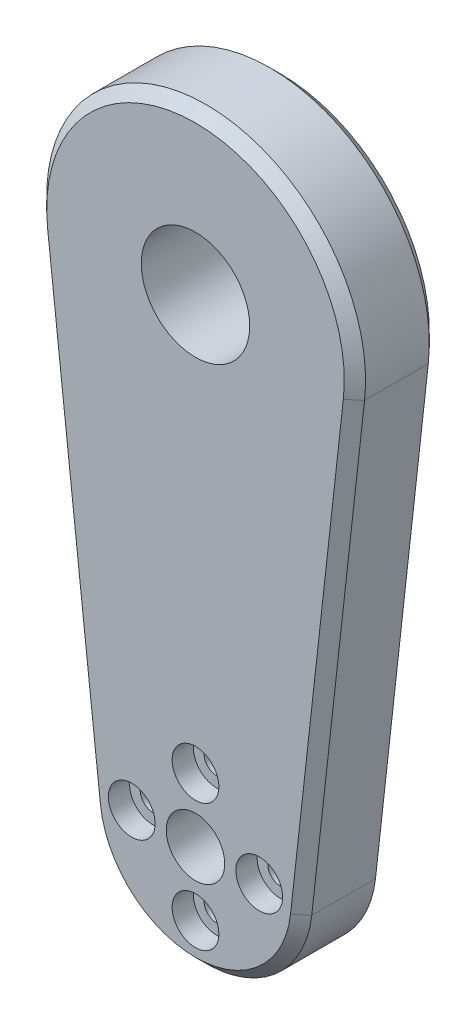
ISO-10303-21;
HEADER;
FILE_DESCRIPTION(('STEP AP214'),'2;1');
FILE_NAME('part.step','',(''),(''),'','','');
FILE_SCHEMA(('AUTOMOTIVE_DESIGN { 1 0 10303 214 1 1 1 1 }'));
ENDSEC;
DATA;
#1=APPLICATION_CONTEXT('core data for automotive mechanical design processes');
#2=APPLICATION_PROTOCOL_DEFINITION('international standard','automotive_design',2000,#1);
#3=PRODUCT_CONTEXT('',#1,'mechanical');
#4=PRODUCT('Part','Part','',(#3));
#5=PRODUCT_RELATED_PRODUCT_CATEGORY('part','',(#4));
#6=PRODUCT_DEFINITION_FORMATION('','',#4);
#7=PRODUCT_DEFINITION_CONTEXT('part definition',#1,'design');
#8=PRODUCT_DEFINITION('design','',#6,#7);
#9=PRODUCT_DEFINITION_SHAPE('','',#8);
#10=(LENGTH_UNIT() NAMED_UNIT(*) SI_UNIT(.MILLI.,.METRE.));
#11=(NAMED_UNIT(*) PLANE_ANGLE_UNIT() SI_UNIT($,.RADIAN.));
#12=(NAMED_UNIT(*) SI_UNIT($,.STERADIAN.) SOLID_ANGLE_UNIT());
#13=UNCERTAINTY_MEASURE_WITH_UNIT(LENGTH_MEASURE(1.E-05),#10,'distance_accuracy_value','');
#14=(GEOMETRIC_REPRESENTATION_CONTEXT(3) GLOBAL_UNCERTAINTY_ASSIGNED_CONTEXT((#13)) GLOBAL_UNIT_ASSIGNED_CONTEXT((#10,
#11,#12)) REPRESENTATION_CONTEXT('',''));
#15=CARTESIAN_POINT('',(0.,0.,0.));
#16=DIRECTION('',(0.,0.,1.));
#17=DIRECTION('',(1.,0.,0.));
#18=AXIS2_PLACEMENT_3D('',#15,#16,#17);
#19=CARTESIAN_POINT('',(9.93807989999907,-1.11111111111111,8.));
#20=DIRECTION('',(-0.993807989999907,0.111111111111111,0.));
#21=DIRECTION('',(-0.111111111111111,-0.993807989999906,0.));
#22=AXIS2_PLACEMENT_3D('',#19,#20,#21);
#23=PLANE('',#22);
#24=DIRECTION('',(0.,0.,-1.));
#25=VECTOR('',#24,1.);
#26=CARTESIAN_POINT('',(14.9071198499986,43.3333333333333,8.));
#27=LINE('',#26,#25);
#28=CARTESIAN_POINT('',(14.9071198499986,43.3333333333333,7.00000000000001));
#29=VERTEX_POINT('',#28);
#30=CARTESIAN_POINT('',(14.9071198499986,43.3333333333333,1.));
#31=VERTEX_POINT('',#30);
#32=EDGE_CURVE('E160',#29,#31,#27,.T.);
#33=ORIENTED_EDGE('',*,*,#32,.F.);
#34=DIRECTION('',(-0.111111111111111,-0.993807989999906,0.));
#35=VECTOR('',#34,1.);
#36=CARTESIAN_POINT('',(9.93807989999907,-1.11111111111111,7.00000000000001));
#37=LINE('',#36,#35);
#38=CARTESIAN_POINT('',(9.93807989999907,-1.11111111111111,7.00000000000001));
#39=VERTEX_POINT('',#38);
#40=EDGE_CURVE('E181',#29,#39,#37,.T.);
#41=ORIENTED_EDGE('',*,*,#40,.T.);
#42=DIRECTION('',(0.,0.,-1.));
#43=VECTOR('',#42,1.);
#44=CARTESIAN_POINT('',(9.93807989999907,-1.11111111111111,8.));
#45=LINE('',#44,#43);
#46=CARTESIAN_POINT('',(9.93807989999907,-1.11111111111111,1.));
#47=VERTEX_POINT('',#46);
#48=EDGE_CURVE('E118',#39,#47,#45,.T.);
#49=ORIENTED_EDGE('',*,*,#48,.T.);
#50=DIRECTION('',(0.111111111111111,0.993807989999906,0.));
#51=VECTOR('',#50,1.);
#52=CARTESIAN_POINT('',(9.93807989999907,-1.11111111111111,1.));
#53=LINE('',#52,#51);
#54=EDGE_CURVE('E178',#47,#31,#53,.T.);
#55=ORIENTED_EDGE('',*,*,#54,.T.);
#56=EDGE_LOOP('',(#33,#41,#49,#55));
#57=FACE_BOUND('',#56,.T.);
#58=ADVANCED_FACE('F42',(#57),#23,.F.);
#59=CARTESIAN_POINT('',(0.,45.,8.));
#60=DIRECTION('',(0.,0.,-1.));
#61=DIRECTION('',(-1.,0.,0.));
#62=AXIS2_PLACEMENT_3D('',#59,#60,#61);
#63=CYLINDRICAL_SURFACE('',#62,15.);
#64=DIRECTION('',(0.,0.,-1.));
#65=VECTOR('',#64,1.);
#66=CARTESIAN_POINT('',(-14.9071198499986,43.3333333333333,8.));
#67=LINE('',#66,#65);
#68=CARTESIAN_POINT('',(-14.9071198499986,43.3333333333333,7.00000000000001));
#69=VERTEX_POINT('',#68);
#70=CARTESIAN_POINT('',(-14.9071198499986,43.3333333333333,1.));
#71=VERTEX_POINT('',#70);
#72=EDGE_CURVE('E137',#69,#71,#67,.T.);
#73=ORIENTED_EDGE('',*,*,#72,.F.);
#74=CARTESIAN_POINT('',(0.,45.,7.00000000000001));
#75=DIRECTION('',(0.,0.,1.));
#76=DIRECTION('',(1.,0.,0.));
#77=AXIS2_PLACEMENT_3D('',#74,#75,#76);
#78=CIRCLE('',#77,15.);
#79=EDGE_CURVE('E175',#69,#29,#78,.F.);
#80=ORIENTED_EDGE('',*,*,#79,.T.);
#81=ORIENTED_EDGE('',*,*,#32,.T.);
#82=CARTESIAN_POINT('',(0.,45.,1.));
#83=DIRECTION('',(0.,0.,1.));
#84=DIRECTION('',(1.,0.,0.));
#85=AXIS2_PLACEMENT_3D('',#82,#83,#84);
#86=CIRCLE('',#85,15.);
#87=EDGE_CURVE('E124',#31,#71,#86,.T.);
#88=ORIENTED_EDGE('',*,*,#87,.T.);
#89=EDGE_LOOP('',(#73,#80,#81,#88));
#90=FACE_BOUND('',#89,.T.);
#91=ADVANCED_FACE('F225',(#90),#63,.T.);
#92=CARTESIAN_POINT('',(-9.93807989999907,-1.11111111111111,8.));
#93=DIRECTION('',(-0.993807989999907,-0.111111111111111,0.));
#94=DIRECTION('',(0.111111111111111,-0.993807989999906,0.));
#95=AXIS2_PLACEMENT_3D('',#92,#93,#94);
#96=PLANE('',#95);
#97=DIRECTION('',(0.,0.,-1.));
#98=VECTOR('',#97,1.);
#99=CARTESIAN_POINT('',(-9.93807989999907,-1.11111111111111,8.));
#100=LINE('',#99,#98);
#101=CARTESIAN_POINT('',(-9.93807989999907,-1.11111111111111,7.00000000000001));
#102=VERTEX_POINT('',#101);
#103=CARTESIAN_POINT('',(-9.93807989999907,-1.11111111111111,1.));
#104=VERTEX_POINT('',#103);
#105=EDGE_CURVE('E116',#102,#104,#100,.T.);
#106=ORIENTED_EDGE('',*,*,#105,.F.);
#107=DIRECTION('',(-0.111111111111111,0.993807989999906,0.));
#108=VECTOR('',#107,1.);
#109=CARTESIAN_POINT('',(-9.93807989999907,-1.11111111111111,7.00000000000001));
#110=LINE('',#109,#108);
#111=EDGE_CURVE('E133',#102,#69,#110,.T.);
#112=ORIENTED_EDGE('',*,*,#111,.T.);
#113=ORIENTED_EDGE('',*,*,#72,.T.);
#114=DIRECTION('',(0.111111111111111,-0.993807989999906,0.));
#115=VECTOR('',#114,1.);
#116=CARTESIAN_POINT('',(-9.93807989999907,-1.11111111111111,1.));
#117=LINE('',#116,#115);
#118=EDGE_CURVE('E135',#71,#104,#117,.T.);
#119=ORIENTED_EDGE('',*,*,#118,.T.);
#120=EDGE_LOOP('',(#106,#112,#113,#119));
#121=FACE_BOUND('',#120,.T.);
#122=ADVANCED_FACE('F130',(#121),#96,.T.);
#123=CARTESIAN_POINT('',(0.,0.,8.));
#124=DIRECTION('',(0.,0.,-1.));
#125=DIRECTION('',(-1.,0.,0.));
#126=AXIS2_PLACEMENT_3D('',#123,#124,#125);
#127=CYLINDRICAL_SURFACE('',#126,2.75);
#128=CARTESIAN_POINT('',(0.,0.,8.));
#129=DIRECTION('',(0.,0.,1.));
#130=DIRECTION('',(1.,0.,0.));
#131=AXIS2_PLACEMENT_3D('',#128,#129,#130);
#132=CIRCLE('',#131,2.75);
#133=CARTESIAN_POINT('',(2.75,0.,8.));
#134=VERTEX_POINT('',#133);
#135=EDGE_CURVE('E232',#134,#134,#132,.T.);
#136=ORIENTED_EDGE('',*,*,#135,.T.);
#137=EDGE_LOOP('',(#136));
#138=FACE_BOUND('',#137,.T.);
#139=CARTESIAN_POINT('',(0.,0.,0.));
#140=DIRECTION('',(0.,0.,1.));
#141=DIRECTION('',(1.,0.,0.));
#142=AXIS2_PLACEMENT_3D('',#139,#140,#141);
#143=CIRCLE('',#142,2.75);
#144=CARTESIAN_POINT('',(2.75,0.,0.));
#145=VERTEX_POINT('',#144);
#146=EDGE_CURVE('E233',#145,#145,#143,.T.);
#147=ORIENTED_EDGE('',*,*,#146,.F.);
#148=EDGE_LOOP('',(#147));
#149=FACE_BOUND('',#148,.T.);
#150=ADVANCED_FACE('F330',(#138,#149),#127,.F.);
#151=CARTESIAN_POINT('',(0.,45.,8.));
#152=DIRECTION('',(0.,0.,-1.));
#153=DIRECTION('',(-1.,0.,0.));
#154=AXIS2_PLACEMENT_3D('',#151,#152,#153);
#155=CYLINDRICAL_SURFACE('',#154,5.1);
#156=CARTESIAN_POINT('',(0.,45.,8.));
#157=DIRECTION('',(0.,0.,1.));
#158=DIRECTION('',(1.,0.,0.));
#159=AXIS2_PLACEMENT_3D('',#156,#157,#158);
#160=CIRCLE('',#159,5.1);
#161=CARTESIAN_POINT('',(5.1,45.,8.));
#162=VERTEX_POINT('',#161);
#163=EDGE_CURVE('E237',#162,#162,#160,.T.);
#164=ORIENTED_EDGE('',*,*,#163,.T.);
#165=EDGE_LOOP('',(#164));
#166=FACE_BOUND('',#165,.T.);
#167=CARTESIAN_POINT('',(0.,45.,0.));
#168=DIRECTION('',(0.,0.,1.));
#169=DIRECTION('',(1.,0.,0.));
#170=AXIS2_PLACEMENT_3D('',#167,#168,#169);
#171=CIRCLE('',#170,5.1);
#172=CARTESIAN_POINT('',(5.1,45.,0.));
#173=VERTEX_POINT('',#172);
#174=EDGE_CURVE('E238',#173,#173,#171,.T.);
#175=ORIENTED_EDGE('',*,*,#174,.F.);
#176=EDGE_LOOP('',(#175));
#177=FACE_BOUND('',#176,.T.);
#178=ADVANCED_FACE('F333',(#166,#177),#155,.F.);
#179=CARTESIAN_POINT('',(0.,0.,8.));
#180=DIRECTION('',(0.,0.,-1.));
#181=DIRECTION('',(-1.,0.,0.));
#182=AXIS2_PLACEMENT_3D('',#179,#180,#181);
#183=CYLINDRICAL_SURFACE('',#182,10.);
#184=ORIENTED_EDGE('',*,*,#48,.F.);
#185=CARTESIAN_POINT('',(0.,0.,7.00000000000001));
#186=DIRECTION('',(0.,0.,1.));
#187=DIRECTION('',(1.,0.,0.));
#188=AXIS2_PLACEMENT_3D('',#185,#186,#187);
#189=CIRCLE('',#188,10.);
#190=EDGE_CURVE('E113',#39,#102,#189,.F.);
#191=ORIENTED_EDGE('',*,*,#190,.T.);
#192=ORIENTED_EDGE('',*,*,#105,.T.);
#193=CARTESIAN_POINT('',(0.,0.,1.));
#194=DIRECTION('',(0.,0.,1.));
#195=DIRECTION('',(1.,0.,0.));
#196=AXIS2_PLACEMENT_3D('',#193,#194,#195);
#197=CIRCLE('',#196,10.);
#198=EDGE_CURVE('E125',#104,#47,#197,.T.);
#199=ORIENTED_EDGE('',*,*,#198,.T.);
#200=EDGE_LOOP('',(#184,#191,#192,#199));
#201=FACE_BOUND('',#200,.T.);
#202=ADVANCED_FACE('F115',(#201),#183,.T.);
#203=CARTESIAN_POINT('',(0.,0.,8.));
#204=DIRECTION('',(0.,0.,1.));
#205=DIRECTION('',(1.,0.,0.));
#206=AXIS2_PLACEMENT_3D('',#203,#204,#205);
#207=PLANE('',#206);
#208=CARTESIAN_POINT('',(0.,45.,8.));
#209=DIRECTION('',(0.,0.,1.));
#210=DIRECTION('',(1.,0.,0.));
#211=AXIS2_PLACEMENT_3D('',#208,#209,#210);
#212=CIRCLE('',#211,14.);
#213=CARTESIAN_POINT('',(13.9133118599987,43.4444444444444,8.));
#214=VERTEX_POINT('',#213);
#215=CARTESIAN_POINT('',(-13.9133118599987,43.4444444444444,8.));
#216=VERTEX_POINT('',#215);
#217=EDGE_CURVE('E158',#214,#216,#212,.T.);
#218=ORIENTED_EDGE('',*,*,#217,.T.);
#219=DIRECTION('',(0.111111111111111,-0.993807989999906,0.));
#220=VECTOR('',#219,1.);
#221=CARTESIAN_POINT('',(-8.94427190999917,-1.,8.));
#222=LINE('',#221,#220);
#223=CARTESIAN_POINT('',(-8.94427190999917,-1.,8.));
#224=VERTEX_POINT('',#223);
#225=EDGE_CURVE('E168',#216,#224,#222,.T.);
#226=ORIENTED_EDGE('',*,*,#225,.T.);
#227=CARTESIAN_POINT('',(0.,0.,8.));
#228=DIRECTION('',(0.,0.,1.));
#229=DIRECTION('',(1.,0.,0.));
#230=AXIS2_PLACEMENT_3D('',#227,#228,#229);
#231=CIRCLE('',#230,9.00000000000001);
#232=CARTESIAN_POINT('',(8.94427190999917,-1.,8.));
#233=VERTEX_POINT('',#232);
#234=EDGE_CURVE('E142',#224,#233,#231,.T.);
#235=ORIENTED_EDGE('',*,*,#234,.T.);
#236=DIRECTION('',(0.111111111111111,0.993807989999906,0.));
#237=VECTOR('',#236,1.);
#238=CARTESIAN_POINT('',(13.9133118599987,43.4444444444444,8.));
#239=LINE('',#238,#237);
#240=EDGE_CURVE('E154',#233,#214,#239,.T.);
#241=ORIENTED_EDGE('',*,*,#240,.T.);
#242=EDGE_LOOP('',(#218,#226,#235,#241));
#243=FACE_BOUND('',#242,.T.);
#244=CARTESIAN_POINT('',(0.,-6.,8.));
#245=DIRECTION('',(0.,0.,1.));
#246=DIRECTION('',(1.,0.,0.));
#247=AXIS2_PLACEMENT_3D('',#244,#245,#246);
#248=CIRCLE('',#247,2.19999999999999);
#249=CARTESIAN_POINT('',(2.19999999999999,-6.,8.));
#250=VERTEX_POINT('',#249);
#251=EDGE_CURVE('E200',#250,#250,#248,.T.);
#252=ORIENTED_EDGE('',*,*,#251,.F.);
#253=EDGE_LOOP('',(#252));
#254=FACE_BOUND('',#253,.T.);
#255=CARTESIAN_POINT('',(-6.,0.,8.));
#256=DIRECTION('',(0.,0.,1.));
#257=DIRECTION('',(1.,0.,0.));
#258=AXIS2_PLACEMENT_3D('',#255,#256,#257);
#259=CIRCLE('',#258,2.19999999999999);
#260=CARTESIAN_POINT('',(-3.80000000000001,0.,8.));
#261=VERTEX_POINT('',#260);
#262=EDGE_CURVE('E292',#261,#261,#259,.T.);
#263=ORIENTED_EDGE('',*,*,#262,.F.);
#264=EDGE_LOOP('',(#263));
#265=FACE_BOUND('',#264,.T.);
#266=CARTESIAN_POINT('',(0.,6.,8.));
#267=DIRECTION('',(0.,0.,1.));
#268=DIRECTION('',(1.,0.,0.));
#269=AXIS2_PLACEMENT_3D('',#266,#267,#268);
#270=CIRCLE('',#269,2.19999999999999);
#271=CARTESIAN_POINT('',(2.19999999999999,6.,8.));
#272=VERTEX_POINT('',#271);
#273=EDGE_CURVE('E276',#272,#272,#270,.T.);
#274=ORIENTED_EDGE('',*,*,#273,.F.);
#275=EDGE_LOOP('',(#274));
#276=FACE_BOUND('',#275,.T.);
#277=CARTESIAN_POINT('',(6.,0.,8.));
#278=DIRECTION('',(0.,0.,1.));
#279=DIRECTION('',(1.,0.,0.));
#280=AXIS2_PLACEMENT_3D('',#277,#278,#279);
#281=CIRCLE('',#280,2.19999999999999);
#282=CARTESIAN_POINT('',(8.19999999999999,0.,8.));
#283=VERTEX_POINT('',#282);
#284=EDGE_CURVE('E260',#283,#283,#281,.T.);
#285=ORIENTED_EDGE('',*,*,#284,.F.);
#286=EDGE_LOOP('',(#285));
#287=FACE_BOUND('',#286,.T.);
#288=ORIENTED_EDGE('',*,*,#163,.F.);
#289=EDGE_LOOP('',(#288));
#290=FACE_BOUND('',#289,.T.);
#291=ORIENTED_EDGE('',*,*,#135,.F.);
#292=EDGE_LOOP('',(#291));
#293=FACE_BOUND('',#292,.T.);
#294=ADVANCED_FACE('F314',(#243,#254,#265,#276,#287,#290,#293),#207,.T.);
#295=CARTESIAN_POINT('',(0.,0.,0.));
#296=DIRECTION('',(0.,0.,1.));
#297=DIRECTION('',(1.,0.,0.));
#298=AXIS2_PLACEMENT_3D('',#295,#296,#297);
#299=PLANE('',#298);
#300=CARTESIAN_POINT('',(0.,0.,0.));
#301=DIRECTION('',(0.,0.,1.));
#302=DIRECTION('',(1.,0.,0.));
#303=AXIS2_PLACEMENT_3D('',#300,#301,#302);
#304=CIRCLE('',#303,8.99999999999999);
#305=CARTESIAN_POINT('',(8.94427190999915,-0.999999999999999,0.));
#306=VERTEX_POINT('',#305);
#307=CARTESIAN_POINT('',(-8.94427190999915,-0.999999999999999,0.));
#308=VERTEX_POINT('',#307);
#309=EDGE_CURVE('E53',#306,#308,#304,.F.);
#310=ORIENTED_EDGE('',*,*,#309,.T.);
#311=DIRECTION('',(-0.111111111111111,0.993807989999906,0.));
#312=VECTOR('',#311,1.);
#313=CARTESIAN_POINT('',(-13.9133118599987,43.4444444444444,0.));
#314=LINE('',#313,#312);
#315=CARTESIAN_POINT('',(-13.9133118599987,43.4444444444444,0.));
#316=VERTEX_POINT('',#315);
#317=EDGE_CURVE('E11',#308,#316,#314,.T.);
#318=ORIENTED_EDGE('',*,*,#317,.T.);
#319=CARTESIAN_POINT('',(0.,45.,0.));
#320=DIRECTION('',(0.,0.,1.));
#321=DIRECTION('',(1.,0.,0.));
#322=AXIS2_PLACEMENT_3D('',#319,#320,#321);
#323=CIRCLE('',#322,14.);
#324=CARTESIAN_POINT('',(13.9133118599987,43.4444444444444,0.));
#325=VERTEX_POINT('',#324);
#326=EDGE_CURVE('E187',#316,#325,#323,.F.);
#327=ORIENTED_EDGE('',*,*,#326,.T.);
#328=DIRECTION('',(-0.111111111111111,-0.993807989999906,0.));
#329=VECTOR('',#328,1.);
#330=CARTESIAN_POINT('',(8.94427190999915,-0.999999999999999,0.));
#331=LINE('',#330,#329);
#332=EDGE_CURVE('E184',#325,#306,#331,.T.);
#333=ORIENTED_EDGE('',*,*,#332,.T.);
#334=EDGE_LOOP('',(#310,#318,#327,#333));
#335=FACE_BOUND('',#334,.T.);
#336=CARTESIAN_POINT('',(0.,-6.,0.));
#337=DIRECTION('',(0.,0.,1.));
#338=DIRECTION('',(1.,0.,0.));
#339=AXIS2_PLACEMENT_3D('',#336,#337,#338);
#340=CIRCLE('',#339,1.2);
#341=CARTESIAN_POINT('',(1.2,-6.,0.));
#342=VERTEX_POINT('',#341);
#343=EDGE_CURVE('E296',#342,#342,#340,.T.);
#344=ORIENTED_EDGE('',*,*,#343,.T.);
#345=EDGE_LOOP('',(#344));
#346=FACE_BOUND('',#345,.T.);
#347=CARTESIAN_POINT('',(-6.,0.,0.));
#348=DIRECTION('',(0.,0.,1.));
#349=DIRECTION('',(1.,0.,0.));
#350=AXIS2_PLACEMENT_3D('',#347,#348,#349);
#351=CIRCLE('',#350,1.2);
#352=CARTESIAN_POINT('',(-4.8,0.,0.));
#353=VERTEX_POINT('',#352);
#354=EDGE_CURVE('E280',#353,#353,#351,.T.);
#355=ORIENTED_EDGE('',*,*,#354,.T.);
#356=EDGE_LOOP('',(#355));
#357=FACE_BOUND('',#356,.T.);
#358=CARTESIAN_POINT('',(0.,6.,0.));
#359=DIRECTION('',(0.,0.,1.));
#360=DIRECTION('',(1.,0.,0.));
#361=AXIS2_PLACEMENT_3D('',#358,#359,#360);
#362=CIRCLE('',#361,1.2);
#363=CARTESIAN_POINT('',(1.2,6.,0.));
#364=VERTEX_POINT('',#363);
#365=EDGE_CURVE('E264',#364,#364,#362,.T.);
#366=ORIENTED_EDGE('',*,*,#365,.T.);
#367=EDGE_LOOP('',(#366));
#368=FACE_BOUND('',#367,.T.);
#369=CARTESIAN_POINT('',(6.,0.,0.));
#370=DIRECTION('',(0.,0.,1.));
#371=DIRECTION('',(1.,0.,0.));
#372=AXIS2_PLACEMENT_3D('',#369,#370,#371);
#373=CIRCLE('',#372,1.2);
#374=CARTESIAN_POINT('',(7.2,0.,0.));
#375=VERTEX_POINT('',#374);
#376=EDGE_CURVE('E242',#375,#375,#373,.T.);
#377=ORIENTED_EDGE('',*,*,#376,.T.);
#378=EDGE_LOOP('',(#377));
#379=FACE_BOUND('',#378,.T.);
#380=ORIENTED_EDGE('',*,*,#174,.T.);
#381=EDGE_LOOP('',(#380));
#382=FACE_BOUND('',#381,.T.);
#383=ORIENTED_EDGE('',*,*,#146,.T.);
#384=EDGE_LOOP('',(#383));
#385=FACE_BOUND('',#384,.T.);
#386=ADVANCED_FACE('F317',(#335,#346,#357,#368,#379,#382,#385),#299,.F.);
#387=CARTESIAN_POINT('',(6.,0.,8.));
#388=DIRECTION('',(0.,0.,1.));
#389=DIRECTION('',(1.,0.,0.));
#390=AXIS2_PLACEMENT_3D('',#387,#388,#389);
#391=CYLINDRICAL_SURFACE('',#390,1.2);
#392=ORIENTED_EDGE('',*,*,#376,.F.);
#393=EDGE_LOOP('',(#392));
#394=FACE_BOUND('',#393,.T.);
#395=CARTESIAN_POINT('',(6.,0.,6.));
#396=DIRECTION('',(0.,0.,1.));
#397=DIRECTION('',(1.,0.,0.));
#398=AXIS2_PLACEMENT_3D('',#395,#396,#397);
#399=CIRCLE('',#398,1.2);
#400=CARTESIAN_POINT('',(7.2,0.,6.));
#401=VERTEX_POINT('',#400);
#402=EDGE_CURVE('E252',#401,#401,#399,.T.);
#403=ORIENTED_EDGE('',*,*,#402,.T.);
#404=EDGE_LOOP('',(#403));
#405=FACE_BOUND('',#404,.T.);
#406=ADVANCED_FACE('F338',(#394,#405),#391,.F.);
#407=CARTESIAN_POINT('',(7.2,0.,6.));
#408=DIRECTION('',(0.,0.,-1.));
#409=DIRECTION('',(-1.,0.,0.));
#410=AXIS2_PLACEMENT_3D('',#407,#408,#409);
#411=PLANE('',#410);
#412=ORIENTED_EDGE('',*,*,#402,.F.);
#413=EDGE_LOOP('',(#412));
#414=FACE_BOUND('',#413,.T.);
#415=CARTESIAN_POINT('',(6.,0.,6.));
#416=DIRECTION('',(0.,0.,1.));
#417=DIRECTION('',(1.,0.,0.));
#418=AXIS2_PLACEMENT_3D('',#415,#416,#417);
#419=CIRCLE('',#418,2.19999999999999);
#420=CARTESIAN_POINT('',(8.19999999999999,0.,6.));
#421=VERTEX_POINT('',#420);
#422=EDGE_CURVE('E256',#421,#421,#419,.T.);
#423=ORIENTED_EDGE('',*,*,#422,.T.);
#424=EDGE_LOOP('',(#423));
#425=FACE_BOUND('',#424,.T.);
#426=ADVANCED_FACE('F344',(#414,#425),#411,.F.);
#427=CARTESIAN_POINT('',(6.,0.,8.));
#428=DIRECTION('',(0.,0.,1.));
#429=DIRECTION('',(1.,0.,0.));
#430=AXIS2_PLACEMENT_3D('',#427,#428,#429);
#431=CYLINDRICAL_SURFACE('',#430,2.19999999999999);
#432=ORIENTED_EDGE('',*,*,#422,.F.);
#433=EDGE_LOOP('',(#432));
#434=FACE_BOUND('',#433,.T.);
#435=ORIENTED_EDGE('',*,*,#284,.T.);
#436=EDGE_LOOP('',(#435));
#437=FACE_BOUND('',#436,.T.);
#438=ADVANCED_FACE('F489',(#434,#437),#431,.F.);
#439=CARTESIAN_POINT('',(0.,6.,8.));
#440=DIRECTION('',(0.,0.,1.));
#441=DIRECTION('',(1.,0.,0.));
#442=AXIS2_PLACEMENT_3D('',#439,#440,#441);
#443=CYLINDRICAL_SURFACE('',#442,1.2);
#444=ORIENTED_EDGE('',*,*,#365,.F.);
#445=EDGE_LOOP('',(#444));
#446=FACE_BOUND('',#445,.T.);
#447=CARTESIAN_POINT('',(0.,6.,6.));
#448=DIRECTION('',(0.,0.,1.));
#449=DIRECTION('',(1.,0.,0.));
#450=AXIS2_PLACEMENT_3D('',#447,#448,#449);
#451=CIRCLE('',#450,1.2);
#452=CARTESIAN_POINT('',(1.2,6.,6.));
#453=VERTEX_POINT('',#452);
#454=EDGE_CURVE('E268',#453,#453,#451,.T.);
#455=ORIENTED_EDGE('',*,*,#454,.T.);
#456=EDGE_LOOP('',(#455));
#457=FACE_BOUND('',#456,.T.);
#458=ADVANCED_FACE('F481',(#446,#457),#443,.F.);
#459=CARTESIAN_POINT('',(1.2,6.,6.));
#460=DIRECTION('',(0.,0.,-1.));
#461=DIRECTION('',(-1.,0.,0.));
#462=AXIS2_PLACEMENT_3D('',#459,#460,#461);
#463=PLANE('',#462);
#464=ORIENTED_EDGE('',*,*,#454,.F.);
#465=EDGE_LOOP('',(#464));
#466=FACE_BOUND('',#465,.T.);
#467=CARTESIAN_POINT('',(0.,6.,6.));
#468=DIRECTION('',(0.,0.,1.));
#469=DIRECTION('',(1.,0.,0.));
#470=AXIS2_PLACEMENT_3D('',#467,#468,#469);
#471=CIRCLE('',#470,2.19999999999999);
#472=CARTESIAN_POINT('',(2.19999999999999,6.,6.));
#473=VERTEX_POINT('',#472);
#474=EDGE_CURVE('E272',#473,#473,#471,.T.);
#475=ORIENTED_EDGE('',*,*,#474,.T.);
#476=EDGE_LOOP('',(#475));
#477=FACE_BOUND('',#476,.T.);
#478=ADVANCED_FACE('F473',(#466,#477),#463,.F.);
#479=CARTESIAN_POINT('',(0.,6.,8.));
#480=DIRECTION('',(0.,0.,1.));
#481=DIRECTION('',(1.,0.,0.));
#482=AXIS2_PLACEMENT_3D('',#479,#480,#481);
#483=CYLINDRICAL_SURFACE('',#482,2.19999999999999);
#484=ORIENTED_EDGE('',*,*,#474,.F.);
#485=EDGE_LOOP('',(#484));
#486=FACE_BOUND('',#485,.T.);
#487=ORIENTED_EDGE('',*,*,#273,.T.);
#488=EDGE_LOOP('',(#487));
#489=FACE_BOUND('',#488,.T.);
#490=ADVANCED_FACE('F465',(#486,#489),#483,.F.);
#491=CARTESIAN_POINT('',(-6.,0.,8.));
#492=DIRECTION('',(0.,0.,1.));
#493=DIRECTION('',(1.,0.,0.));
#494=AXIS2_PLACEMENT_3D('',#491,#492,#493);
#495=CYLINDRICAL_SURFACE('',#494,1.2);
#496=ORIENTED_EDGE('',*,*,#354,.F.);
#497=EDGE_LOOP('',(#496));
#498=FACE_BOUND('',#497,.T.);
#499=CARTESIAN_POINT('',(-6.,0.,6.));
#500=DIRECTION('',(0.,0.,1.));
#501=DIRECTION('',(1.,0.,0.));
#502=AXIS2_PLACEMENT_3D('',#499,#500,#501);
#503=CIRCLE('',#502,1.2);
#504=CARTESIAN_POINT('',(-4.8,0.,6.));
#505=VERTEX_POINT('',#504);
#506=EDGE_CURVE('E284',#505,#505,#503,.T.);
#507=ORIENTED_EDGE('',*,*,#506,.T.);
#508=EDGE_LOOP('',(#507));
#509=FACE_BOUND('',#508,.T.);
#510=ADVANCED_FACE('F457',(#498,#509),#495,.F.);
#511=CARTESIAN_POINT('',(-4.8,0.,6.));
#512=DIRECTION('',(0.,0.,-1.));
#513=DIRECTION('',(-1.,0.,0.));
#514=AXIS2_PLACEMENT_3D('',#511,#512,#513);
#515=PLANE('',#514);
#516=ORIENTED_EDGE('',*,*,#506,.F.);
#517=EDGE_LOOP('',(#516));
#518=FACE_BOUND('',#517,.T.);
#519=CARTESIAN_POINT('',(-6.,0.,6.));
#520=DIRECTION('',(0.,0.,1.));
#521=DIRECTION('',(1.,0.,0.));
#522=AXIS2_PLACEMENT_3D('',#519,#520,#521);
#523=CIRCLE('',#522,2.19999999999999);
#524=CARTESIAN_POINT('',(-3.80000000000001,0.,6.));
#525=VERTEX_POINT('',#524);
#526=EDGE_CURVE('E288',#525,#525,#523,.T.);
#527=ORIENTED_EDGE('',*,*,#526,.T.);
#528=EDGE_LOOP('',(#527));
#529=FACE_BOUND('',#528,.T.);
#530=ADVANCED_FACE('F449',(#518,#529),#515,.F.);
#531=CARTESIAN_POINT('',(-6.,0.,8.));
#532=DIRECTION('',(0.,0.,1.));
#533=DIRECTION('',(1.,0.,0.));
#534=AXIS2_PLACEMENT_3D('',#531,#532,#533);
#535=CYLINDRICAL_SURFACE('',#534,2.19999999999999);
#536=ORIENTED_EDGE('',*,*,#526,.F.);
#537=EDGE_LOOP('',(#536));
#538=FACE_BOUND('',#537,.T.);
#539=ORIENTED_EDGE('',*,*,#262,.T.);
#540=EDGE_LOOP('',(#539));
#541=FACE_BOUND('',#540,.T.);
#542=ADVANCED_FACE('F441',(#538,#541),#535,.F.);
#543=CARTESIAN_POINT('',(0.,-6.,8.));
#544=DIRECTION('',(0.,0.,1.));
#545=DIRECTION('',(1.,0.,0.));
#546=AXIS2_PLACEMENT_3D('',#543,#544,#545);
#547=CYLINDRICAL_SURFACE('',#546,1.2);
#548=ORIENTED_EDGE('',*,*,#343,.F.);
#549=EDGE_LOOP('',(#548));
#550=FACE_BOUND('',#549,.T.);
#551=CARTESIAN_POINT('',(0.,-6.,6.));
#552=DIRECTION('',(0.,0.,1.));
#553=DIRECTION('',(1.,0.,0.));
#554=AXIS2_PLACEMENT_3D('',#551,#552,#553);
#555=CIRCLE('',#554,1.2);
#556=CARTESIAN_POINT('',(1.2,-6.,6.));
#557=VERTEX_POINT('',#556);
#558=EDGE_CURVE('E300',#557,#557,#555,.T.);
#559=ORIENTED_EDGE('',*,*,#558,.T.);
#560=EDGE_LOOP('',(#559));
#561=FACE_BOUND('',#560,.T.);
#562=ADVANCED_FACE('F433',(#550,#561),#547,.F.);
#563=CARTESIAN_POINT('',(1.2,-6.,6.));
#564=DIRECTION('',(0.,0.,-1.));
#565=DIRECTION('',(-1.,0.,0.));
#566=AXIS2_PLACEMENT_3D('',#563,#564,#565);
#567=PLANE('',#566);
#568=ORIENTED_EDGE('',*,*,#558,.F.);
#569=EDGE_LOOP('',(#568));
#570=FACE_BOUND('',#569,.T.);
#571=CARTESIAN_POINT('',(0.,-6.,6.));
#572=DIRECTION('',(0.,0.,1.));
#573=DIRECTION('',(1.,0.,0.));
#574=AXIS2_PLACEMENT_3D('',#571,#572,#573);
#575=CIRCLE('',#574,2.19999999999999);
#576=CARTESIAN_POINT('',(2.19999999999999,-6.,6.));
#577=VERTEX_POINT('',#576);
#578=EDGE_CURVE('E304',#577,#577,#575,.T.);
#579=ORIENTED_EDGE('',*,*,#578,.T.);
#580=EDGE_LOOP('',(#579));
#581=FACE_BOUND('',#580,.T.);
#582=ADVANCED_FACE('F425',(#570,#581),#567,.F.);
#583=CARTESIAN_POINT('',(0.,-6.,8.));
#584=DIRECTION('',(0.,0.,1.));
#585=DIRECTION('',(1.,0.,0.));
#586=AXIS2_PLACEMENT_3D('',#583,#584,#585);
#587=CYLINDRICAL_SURFACE('',#586,2.19999999999999);
#588=ORIENTED_EDGE('',*,*,#578,.F.);
#589=EDGE_LOOP('',(#588));
#590=FACE_BOUND('',#589,.T.);
#591=ORIENTED_EDGE('',*,*,#251,.T.);
#592=EDGE_LOOP('',(#591));
#593=FACE_BOUND('',#592,.T.);
#594=ADVANCED_FACE('F312',(#590,#593),#587,.F.);
#595=CARTESIAN_POINT('',(8.94427190999917,-1.,8.));
#596=DIRECTION('',(0.702728368926306,-0.0785674201318385,0.707106781186548));
#597=DIRECTION('',(-0.111111111111111,-0.993807989999906,0.));
#598=AXIS2_PLACEMENT_3D('',#595,#596,#597);
#599=PLANE('',#598);
#600=DIRECTION('',(0.702728368926308,-0.0785674201318389,-0.707106781186546));
#601=VECTOR('',#600,1.);
#602=CARTESIAN_POINT('',(13.9133118599987,43.4444444444444,8.));
#603=LINE('',#602,#601);
#604=EDGE_CURVE('E147',#214,#29,#603,.T.);
#605=ORIENTED_EDGE('',*,*,#604,.F.);
#606=ORIENTED_EDGE('',*,*,#240,.F.);
#607=DIRECTION('',(-0.702728368926308,0.0785674201318389,0.707106781186546));
#608=VECTOR('',#607,1.);
#609=CARTESIAN_POINT('',(9.93807989999907,-1.11111111111111,7.00000000000001));
#610=LINE('',#609,#608);
#611=EDGE_CURVE('E197',#39,#233,#610,.T.);
#612=ORIENTED_EDGE('',*,*,#611,.F.);
#613=ORIENTED_EDGE('',*,*,#40,.F.);
#614=EDGE_LOOP('',(#605,#606,#612,#613));
#615=FACE_BOUND('',#614,.T.);
#616=ADVANCED_FACE('F379',(#615),#599,.T.);
#617=CARTESIAN_POINT('',(0.,0.,8.));
#618=DIRECTION('',(0.,0.,-1.));
#619=DIRECTION('',(-1.,0.,0.));
#620=AXIS2_PLACEMENT_3D('',#617,#618,#619);
#621=CONICAL_SURFACE('',#620,9.00000000000001,0.785398163397448);
#622=ORIENTED_EDGE('',*,*,#611,.T.);
#623=ORIENTED_EDGE('',*,*,#234,.F.);
#624=DIRECTION('',(0.702728368926307,0.0785674201318387,0.707106781186547));
#625=VECTOR('',#624,1.);
#626=CARTESIAN_POINT('',(-9.93807989999907,-1.11111111111111,7.00000000000001));
#627=LINE('',#626,#625);
#628=EDGE_CURVE('E140',#102,#224,#627,.T.);
#629=ORIENTED_EDGE('',*,*,#628,.F.);
#630=ORIENTED_EDGE('',*,*,#190,.F.);
#631=EDGE_LOOP('',(#622,#623,#629,#630));
#632=FACE_BOUND('',#631,.T.);
#633=ADVANCED_FACE('F141',(#632),#621,.T.);
#634=CARTESIAN_POINT('',(0.,45.,8.));
#635=DIRECTION('',(0.,0.,-1.));
#636=DIRECTION('',(-1.,0.,0.));
#637=AXIS2_PLACEMENT_3D('',#634,#635,#636);
#638=CONICAL_SURFACE('',#637,14.,0.785398163397448);
#639=ORIENTED_EDGE('',*,*,#604,.T.);
#640=ORIENTED_EDGE('',*,*,#79,.F.);
#641=DIRECTION('',(-0.702728368926307,-0.0785674201318391,-0.707106781186547));
#642=VECTOR('',#641,1.);
#643=CARTESIAN_POINT('',(-13.9133118599987,43.4444444444444,8.));
#644=LINE('',#643,#642);
#645=EDGE_CURVE('E148',#216,#69,#644,.T.);
#646=ORIENTED_EDGE('',*,*,#645,.F.);
#647=ORIENTED_EDGE('',*,*,#217,.F.);
#648=EDGE_LOOP('',(#639,#640,#646,#647));
#649=FACE_BOUND('',#648,.T.);
#650=ADVANCED_FACE('F367',(#649),#638,.T.);
#651=CARTESIAN_POINT('',(-9.93807989999907,-1.11111111111111,7.00000000000001));
#652=DIRECTION('',(0.702728368926306,0.0785674201318385,-0.707106781186548));
#653=DIRECTION('',(-0.111111111111111,0.993807989999906,0.));
#654=AXIS2_PLACEMENT_3D('',#651,#652,#653);
#655=PLANE('',#654);
#656=ORIENTED_EDGE('',*,*,#628,.T.);
#657=ORIENTED_EDGE('',*,*,#225,.F.);
#658=ORIENTED_EDGE('',*,*,#645,.T.);
#659=ORIENTED_EDGE('',*,*,#111,.F.);
#660=EDGE_LOOP('',(#656,#657,#658,#659));
#661=FACE_BOUND('',#660,.T.);
#662=ADVANCED_FACE('F150',(#661),#655,.F.);
#663=CARTESIAN_POINT('',(9.93807989999907,-1.11111111111111,1.));
#664=DIRECTION('',(-0.702728368926303,0.0785674201318382,0.707106781186551));
#665=DIRECTION('',(0.111111111111111,0.993807989999906,0.));
#666=AXIS2_PLACEMENT_3D('',#663,#664,#665);
#667=PLANE('',#666);
#668=DIRECTION('',(-0.702728368926309,0.0785674201318377,-0.707106781186545));
#669=VECTOR('',#668,1.);
#670=CARTESIAN_POINT('',(14.9071198499986,43.3333333333333,1.));
#671=LINE('',#670,#669);
#672=EDGE_CURVE('E205',#31,#325,#671,.T.);
#673=ORIENTED_EDGE('',*,*,#672,.F.);
#674=ORIENTED_EDGE('',*,*,#54,.F.);
#675=DIRECTION('',(0.702728368926309,-0.0785674201318389,0.707106781186545));
#676=VECTOR('',#675,1.);
#677=CARTESIAN_POINT('',(8.94427190999915,-0.999999999999999,0.));
#678=LINE('',#677,#676);
#679=EDGE_CURVE('E47',#306,#47,#678,.T.);
#680=ORIENTED_EDGE('',*,*,#679,.F.);
#681=ORIENTED_EDGE('',*,*,#332,.F.);
#682=EDGE_LOOP('',(#673,#674,#680,#681));
#683=FACE_BOUND('',#682,.T.);
#684=ADVANCED_FACE('F45',(#683),#667,.F.);
#685=CARTESIAN_POINT('',(0.,0.,1.));
#686=DIRECTION('',(0.,0.,1.));
#687=DIRECTION('',(1.,0.,0.));
#688=AXIS2_PLACEMENT_3D('',#685,#686,#687);
#689=CONICAL_SURFACE('',#688,10.,0.785398163397452);
#690=ORIENTED_EDGE('',*,*,#679,.T.);
#691=ORIENTED_EDGE('',*,*,#198,.F.);
#692=DIRECTION('',(-0.702728368926309,-0.0785674201318388,0.707106781186545));
#693=VECTOR('',#692,1.);
#694=CARTESIAN_POINT('',(-8.94427190999915,-0.999999999999999,0.));
#695=LINE('',#694,#693);
#696=EDGE_CURVE('E203',#308,#104,#695,.T.);
#697=ORIENTED_EDGE('',*,*,#696,.F.);
#698=ORIENTED_EDGE('',*,*,#309,.F.);
#699=EDGE_LOOP('',(#690,#691,#697,#698));
#700=FACE_BOUND('',#699,.T.);
#701=ADVANCED_FACE('F216',(#700),#689,.T.);
#702=CARTESIAN_POINT('',(0.,45.,1.));
#703=DIRECTION('',(0.,0.,1.));
#704=DIRECTION('',(1.,0.,0.));
#705=AXIS2_PLACEMENT_3D('',#702,#703,#704);
#706=CONICAL_SURFACE('',#705,15.,0.785398163397452);
#707=ORIENTED_EDGE('',*,*,#672,.T.);
#708=ORIENTED_EDGE('',*,*,#326,.F.);
#709=DIRECTION('',(0.702728368926309,0.0785674201318378,-0.707106781186545));
#710=VECTOR('',#709,1.);
#711=CARTESIAN_POINT('',(-14.9071198499986,43.3333333333333,1.));
#712=LINE('',#711,#710);
#713=EDGE_CURVE('E67',#71,#316,#712,.T.);
#714=ORIENTED_EDGE('',*,*,#713,.F.);
#715=ORIENTED_EDGE('',*,*,#87,.F.);
#716=EDGE_LOOP('',(#707,#708,#714,#715));
#717=FACE_BOUND('',#716,.T.);
#718=ADVANCED_FACE('F392',(#717),#706,.T.);
#719=CARTESIAN_POINT('',(-8.94427190999915,-0.999999999999999,0.));
#720=DIRECTION('',(-0.702728368926303,-0.0785674201318382,-0.707106781186551));
#721=DIRECTION('',(0.111111111111111,-0.993807989999906,0.));
#722=AXIS2_PLACEMENT_3D('',#719,#720,#721);
#723=PLANE('',#722);
#724=ORIENTED_EDGE('',*,*,#696,.T.);
#725=ORIENTED_EDGE('',*,*,#118,.F.);
#726=ORIENTED_EDGE('',*,*,#713,.T.);
#727=ORIENTED_EDGE('',*,*,#317,.F.);
#728=EDGE_LOOP('',(#724,#725,#726,#727));
#729=FACE_BOUND('',#728,.T.);
#730=ADVANCED_FACE('F386',(#729),#723,.T.);
#731=CLOSED_SHELL('',(#58,#91,#122,#150,#178,#202,#294,#386,#406,#426,#438,#458,#478,#490,#510,
#530,#542,#562,#582,#594,#616,#633,#650,#662,#684,#701,#718,#730));
#732=MANIFOLD_SOLID_BREP('B2',#731);
#733=ADVANCED_BREP_SHAPE_REPRESENTATION('',(#18,#732),#14);
#734=SHAPE_DEFINITION_REPRESENTATION(#9,#733);
ENDSEC;
END-ISO-10303-21;
